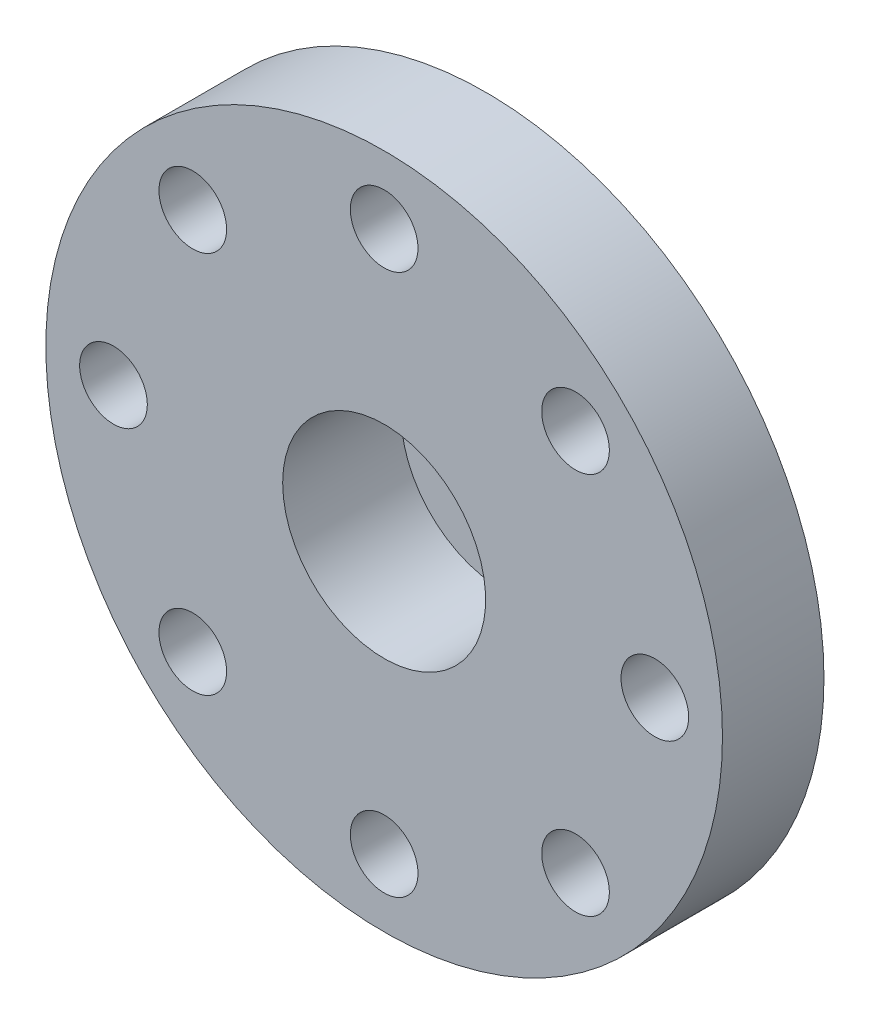
ISO-10303-21;
HEADER;
FILE_DESCRIPTION(('STEP AP214'),'2;1');
FILE_NAME('part.step','',(''),(''),'','','');
FILE_SCHEMA(('AUTOMOTIVE_DESIGN { 1 0 10303 214 1 1 1 1 }'));
ENDSEC;
DATA;
#1=APPLICATION_CONTEXT('core data for automotive mechanical design processes');
#2=APPLICATION_PROTOCOL_DEFINITION('international standard','automotive_design',2000,#1);
#3=PRODUCT_CONTEXT('',#1,'mechanical');
#4=PRODUCT('Part','Part','',(#3));
#5=PRODUCT_RELATED_PRODUCT_CATEGORY('part','',(#4));
#6=PRODUCT_DEFINITION_FORMATION('','',#4);
#7=PRODUCT_DEFINITION_CONTEXT('part definition',#1,'design');
#8=PRODUCT_DEFINITION('design','',#6,#7);
#9=PRODUCT_DEFINITION_SHAPE('','',#8);
#10=(LENGTH_UNIT() NAMED_UNIT(*) SI_UNIT(.MILLI.,.METRE.));
#11=(NAMED_UNIT(*) PLANE_ANGLE_UNIT() SI_UNIT($,.RADIAN.));
#12=(NAMED_UNIT(*) SI_UNIT($,.STERADIAN.) SOLID_ANGLE_UNIT());
#13=UNCERTAINTY_MEASURE_WITH_UNIT(LENGTH_MEASURE(1.E-05),#10,'distance_accuracy_value','');
#14=(GEOMETRIC_REPRESENTATION_CONTEXT(3) GLOBAL_UNCERTAINTY_ASSIGNED_CONTEXT((#13)) GLOBAL_UNIT_ASSIGNED_CONTEXT((#10,
#11,#12)) REPRESENTATION_CONTEXT('',''));
#15=CARTESIAN_POINT('',(0.,0.,0.));
#16=DIRECTION('',(0.,0.,1.));
#17=DIRECTION('',(1.,0.,0.));
#18=AXIS2_PLACEMENT_3D('',#15,#16,#17);
#19=CARTESIAN_POINT('',(0.,0.,3.));
#20=DIRECTION('',(0.,0.,1.));
#21=DIRECTION('',(1.,0.,0.));
#22=AXIS2_PLACEMENT_3D('',#19,#20,#21);
#23=PLANE('',#22);
#24=CARTESIAN_POINT('',(0.,0.,3.));
#25=DIRECTION('',(0.,0.,-1.));
#26=DIRECTION('',(-1.,0.,0.));
#27=AXIS2_PLACEMENT_3D('',#24,#25,#26);
#28=CIRCLE('',#27,3.);
#29=CARTESIAN_POINT('',(-3.,0.,3.));
#30=VERTEX_POINT('',#29);
#31=EDGE_CURVE('E103',#30,#30,#28,.T.);
#32=ORIENTED_EDGE('',*,*,#31,.T.);
#33=EDGE_LOOP('',(#32));
#34=FACE_BOUND('',#33,.T.);
#35=CARTESIAN_POINT('',(-7.99999999999966,-3.39548594421663E-13,3.));
#36=DIRECTION('',(0.,0.,1.));
#37=DIRECTION('',(1.,0.,0.));
#38=AXIS2_PLACEMENT_3D('',#35,#36,#37);
#39=CIRCLE('',#38,1.0000000000005);
#40=CARTESIAN_POINT('',(-6.99999999999916,-3.39548594421663E-13,3.));
#41=VERTEX_POINT('',#40);
#42=EDGE_CURVE('E85',#41,#41,#39,.T.);
#43=ORIENTED_EDGE('',*,*,#42,.F.);
#44=EDGE_LOOP('',(#43));
#45=FACE_BOUND('',#44,.T.);
#46=CARTESIAN_POINT('',(6.77137753964691E-13,-8.,3.));
#47=DIRECTION('',(0.,0.,1.));
#48=DIRECTION('',(1.,0.,0.));
#49=AXIS2_PLACEMENT_3D('',#46,#47,#48);
#50=CIRCLE('',#49,1.0000000000007);
#51=CARTESIAN_POINT('',(1.00000000000138,-8.,3.));
#52=VERTEX_POINT('',#51);
#53=EDGE_CURVE('E73',#52,#52,#50,.T.);
#54=ORIENTED_EDGE('',*,*,#53,.F.);
#55=EDGE_LOOP('',(#54));
#56=FACE_BOUND('',#55,.T.);
#57=CARTESIAN_POINT('',(8.00000000000034,3.38568876982346E-13,3.));
#58=DIRECTION('',(0.,0.,1.));
#59=DIRECTION('',(1.,0.,0.));
#60=AXIS2_PLACEMENT_3D('',#57,#58,#59);
#61=CIRCLE('',#60,1.00000000000025);
#62=CARTESIAN_POINT('',(9.00000000000059,3.38568876982346E-13,3.));
#63=VERTEX_POINT('',#62);
#64=EDGE_CURVE('E61',#63,#63,#61,.T.);
#65=ORIENTED_EDGE('',*,*,#64,.F.);
#66=EDGE_LOOP('',(#65));
#67=FACE_BOUND('',#66,.T.);
#68=CARTESIAN_POINT('',(0.,8.,3.));
#69=DIRECTION('',(0.,0.,1.));
#70=DIRECTION('',(1.,0.,0.));
#71=AXIS2_PLACEMENT_3D('',#68,#69,#70);
#72=CIRCLE('',#71,1.);
#73=CARTESIAN_POINT('',(0.999999999999999,8.,3.));
#74=VERTEX_POINT('',#73);
#75=EDGE_CURVE('E50',#74,#74,#72,.T.);
#76=ORIENTED_EDGE('',*,*,#75,.F.);
#77=EDGE_LOOP('',(#76));
#78=FACE_BOUND('',#77,.T.);
#79=CARTESIAN_POINT('',(0.,0.,3.));
#80=DIRECTION('',(0.,0.,1.));
#81=DIRECTION('',(1.,0.,0.));
#82=AXIS2_PLACEMENT_3D('',#79,#80,#81);
#83=CIRCLE('',#82,10.);
#84=CARTESIAN_POINT('',(10.,0.,3.));
#85=VERTEX_POINT('',#84);
#86=EDGE_CURVE('E42',#85,#85,#83,.T.);
#87=ORIENTED_EDGE('',*,*,#86,.T.);
#88=EDGE_LOOP('',(#87));
#89=FACE_BOUND('',#88,.T.);
#90=CARTESIAN_POINT('',(5.65685424949239,5.65685424949237,3.));
#91=DIRECTION('',(0.,0.,1.));
#92=DIRECTION('',(1.,0.,0.));
#93=AXIS2_PLACEMENT_3D('',#90,#91,#92);
#94=CIRCLE('',#93,1.);
#95=CARTESIAN_POINT('',(6.65685424949239,5.65685424949237,3.));
#96=VERTEX_POINT('',#95);
#97=EDGE_CURVE('E55',#96,#96,#94,.T.);
#98=ORIENTED_EDGE('',*,*,#97,.F.);
#99=EDGE_LOOP('',(#98));
#100=FACE_BOUND('',#99,.T.);
#101=CARTESIAN_POINT('',(5.65685424949296,-5.65685424949214,3.));
#102=DIRECTION('',(0.,0.,1.));
#103=DIRECTION('',(1.,0.,0.));
#104=AXIS2_PLACEMENT_3D('',#101,#102,#103);
#105=CIRCLE('',#104,1.00000000000052);
#106=CARTESIAN_POINT('',(6.65685424949348,-5.65685424949214,3.));
#107=VERTEX_POINT('',#106);
#108=EDGE_CURVE('E67',#107,#107,#105,.T.);
#109=ORIENTED_EDGE('',*,*,#108,.F.);
#110=EDGE_LOOP('',(#109));
#111=FACE_BOUND('',#110,.T.);
#112=CARTESIAN_POINT('',(-5.6568542494918,-5.65685424949262,3.));
#113=DIRECTION('',(0.,0.,1.));
#114=DIRECTION('',(1.,0.,0.));
#115=AXIS2_PLACEMENT_3D('',#112,#113,#114);
#116=CIRCLE('',#115,1.00000000000069);
#117=CARTESIAN_POINT('',(-4.65685424949111,-5.65685424949262,3.));
#118=VERTEX_POINT('',#117);
#119=EDGE_CURVE('E79',#118,#118,#116,.T.);
#120=ORIENTED_EDGE('',*,*,#119,.F.);
#121=EDGE_LOOP('',(#120));
#122=FACE_BOUND('',#121,.T.);
#123=CARTESIAN_POINT('',(-5.65685424949231,5.65685424949245,3.));
#124=DIRECTION('',(0.,0.,1.));
#125=DIRECTION('',(1.,0.,0.));
#126=AXIS2_PLACEMENT_3D('',#123,#124,#125);
#127=CIRCLE('',#126,1.);
#128=CARTESIAN_POINT('',(-4.65685424949231,5.65685424949245,3.));
#129=VERTEX_POINT('',#128);
#130=EDGE_CURVE('E91',#129,#129,#127,.T.);
#131=ORIENTED_EDGE('',*,*,#130,.F.);
#132=EDGE_LOOP('',(#131));
#133=FACE_BOUND('',#132,.T.);
#134=ADVANCED_FACE('F34',(#34,#45,#56,#67,#78,#89,#100,#111,#122,#133),#23,.T.);
#135=CARTESIAN_POINT('',(0.,0.,0.));
#136=DIRECTION('',(0.,0.,1.));
#137=DIRECTION('',(1.,0.,0.));
#138=AXIS2_PLACEMENT_3D('',#135,#136,#137);
#139=PLANE('',#138);
#140=CARTESIAN_POINT('',(0.,0.,0.));
#141=DIRECTION('',(0.,0.,1.));
#142=DIRECTION('',(1.,0.,0.));
#143=AXIS2_PLACEMENT_3D('',#140,#141,#142);
#144=CIRCLE('',#143,4.5);
#145=CARTESIAN_POINT('',(4.5,0.,0.));
#146=VERTEX_POINT('',#145);
#147=EDGE_CURVE('E10',#146,#146,#144,.F.);
#148=ORIENTED_EDGE('',*,*,#147,.F.);
#149=EDGE_LOOP('',(#148));
#150=FACE_BOUND('',#149,.T.);
#151=CARTESIAN_POINT('',(0.,0.,0.));
#152=DIRECTION('',(0.,0.,1.));
#153=DIRECTION('',(1.,0.,0.));
#154=AXIS2_PLACEMENT_3D('',#151,#152,#153);
#155=CIRCLE('',#154,10.);
#156=CARTESIAN_POINT('',(10.,0.,0.));
#157=VERTEX_POINT('',#156);
#158=EDGE_CURVE('E46',#157,#157,#155,.T.);
#159=ORIENTED_EDGE('',*,*,#158,.F.);
#160=EDGE_LOOP('',(#159));
#161=FACE_BOUND('',#160,.T.);
#162=CARTESIAN_POINT('',(0.,8.,0.));
#163=DIRECTION('',(0.,0.,1.));
#164=DIRECTION('',(1.,0.,0.));
#165=AXIS2_PLACEMENT_3D('',#162,#163,#164);
#166=CIRCLE('',#165,1.);
#167=CARTESIAN_POINT('',(0.999999999999999,8.,0.));
#168=VERTEX_POINT('',#167);
#169=EDGE_CURVE('E52',#168,#168,#166,.T.);
#170=ORIENTED_EDGE('',*,*,#169,.T.);
#171=EDGE_LOOP('',(#170));
#172=FACE_BOUND('',#171,.T.);
#173=CARTESIAN_POINT('',(5.65685424949239,5.65685424949237,0.));
#174=DIRECTION('',(0.,0.,1.));
#175=DIRECTION('',(1.,0.,0.));
#176=AXIS2_PLACEMENT_3D('',#173,#174,#175);
#177=CIRCLE('',#176,1.);
#178=CARTESIAN_POINT('',(6.65685424949239,5.65685424949237,0.));
#179=VERTEX_POINT('',#178);
#180=EDGE_CURVE('E58',#179,#179,#177,.T.);
#181=ORIENTED_EDGE('',*,*,#180,.T.);
#182=EDGE_LOOP('',(#181));
#183=FACE_BOUND('',#182,.T.);
#184=CARTESIAN_POINT('',(8.00000000000034,3.38568876982346E-13,0.));
#185=DIRECTION('',(0.,0.,1.));
#186=DIRECTION('',(1.,0.,0.));
#187=AXIS2_PLACEMENT_3D('',#184,#185,#186);
#188=CIRCLE('',#187,1.00000000000025);
#189=CARTESIAN_POINT('',(9.00000000000059,3.38568876982346E-13,0.));
#190=VERTEX_POINT('',#189);
#191=EDGE_CURVE('E64',#190,#190,#188,.T.);
#192=ORIENTED_EDGE('',*,*,#191,.T.);
#193=EDGE_LOOP('',(#192));
#194=FACE_BOUND('',#193,.T.);
#195=CARTESIAN_POINT('',(5.65685424949296,-5.65685424949214,0.));
#196=DIRECTION('',(0.,0.,1.));
#197=DIRECTION('',(1.,0.,0.));
#198=AXIS2_PLACEMENT_3D('',#195,#196,#197);
#199=CIRCLE('',#198,1.00000000000052);
#200=CARTESIAN_POINT('',(6.65685424949348,-5.65685424949214,0.));
#201=VERTEX_POINT('',#200);
#202=EDGE_CURVE('E70',#201,#201,#199,.T.);
#203=ORIENTED_EDGE('',*,*,#202,.T.);
#204=EDGE_LOOP('',(#203));
#205=FACE_BOUND('',#204,.T.);
#206=CARTESIAN_POINT('',(6.77137753964691E-13,-8.,0.));
#207=DIRECTION('',(0.,0.,1.));
#208=DIRECTION('',(1.,0.,0.));
#209=AXIS2_PLACEMENT_3D('',#206,#207,#208);
#210=CIRCLE('',#209,1.0000000000007);
#211=CARTESIAN_POINT('',(1.00000000000138,-8.,0.));
#212=VERTEX_POINT('',#211);
#213=EDGE_CURVE('E76',#212,#212,#210,.T.);
#214=ORIENTED_EDGE('',*,*,#213,.T.);
#215=EDGE_LOOP('',(#214));
#216=FACE_BOUND('',#215,.T.);
#217=CARTESIAN_POINT('',(-5.6568542494918,-5.65685424949262,0.));
#218=DIRECTION('',(0.,0.,1.));
#219=DIRECTION('',(1.,0.,0.));
#220=AXIS2_PLACEMENT_3D('',#217,#218,#219);
#221=CIRCLE('',#220,1.00000000000069);
#222=CARTESIAN_POINT('',(-4.65685424949111,-5.65685424949262,0.));
#223=VERTEX_POINT('',#222);
#224=EDGE_CURVE('E82',#223,#223,#221,.T.);
#225=ORIENTED_EDGE('',*,*,#224,.T.);
#226=EDGE_LOOP('',(#225));
#227=FACE_BOUND('',#226,.T.);
#228=CARTESIAN_POINT('',(-7.99999999999966,-3.39548594421663E-13,0.));
#229=DIRECTION('',(0.,0.,1.));
#230=DIRECTION('',(1.,0.,0.));
#231=AXIS2_PLACEMENT_3D('',#228,#229,#230);
#232=CIRCLE('',#231,1.0000000000005);
#233=CARTESIAN_POINT('',(-6.99999999999916,-3.39548594421663E-13,0.));
#234=VERTEX_POINT('',#233);
#235=EDGE_CURVE('E88',#234,#234,#232,.T.);
#236=ORIENTED_EDGE('',*,*,#235,.T.);
#237=EDGE_LOOP('',(#236));
#238=FACE_BOUND('',#237,.T.);
#239=CARTESIAN_POINT('',(-5.65685424949231,5.65685424949245,0.));
#240=DIRECTION('',(0.,0.,1.));
#241=DIRECTION('',(1.,0.,0.));
#242=AXIS2_PLACEMENT_3D('',#239,#240,#241);
#243=CIRCLE('',#242,1.);
#244=CARTESIAN_POINT('',(-4.65685424949231,5.65685424949245,0.));
#245=VERTEX_POINT('',#244);
#246=EDGE_CURVE('E94',#245,#245,#243,.T.);
#247=ORIENTED_EDGE('',*,*,#246,.T.);
#248=EDGE_LOOP('',(#247));
#249=FACE_BOUND('',#248,.T.);
#250=ADVANCED_FACE('F127',(#150,#161,#172,#183,#194,#205,#216,#227,#238,#249),#139,.F.);
#251=CARTESIAN_POINT('',(0.,0.,3.));
#252=DIRECTION('',(0.,0.,-1.));
#253=DIRECTION('',(-1.,0.,0.));
#254=AXIS2_PLACEMENT_3D('',#251,#252,#253);
#255=CYLINDRICAL_SURFACE('',#254,10.);
#256=ORIENTED_EDGE('',*,*,#86,.F.);
#257=EDGE_LOOP('',(#256));
#258=FACE_BOUND('',#257,.T.);
#259=ORIENTED_EDGE('',*,*,#158,.T.);
#260=EDGE_LOOP('',(#259));
#261=FACE_BOUND('',#260,.T.);
#262=ADVANCED_FACE('F36',(#258,#261),#255,.T.);
#263=CARTESIAN_POINT('',(0.,8.,3.));
#264=DIRECTION('',(0.,0.,-1.));
#265=DIRECTION('',(-1.,0.,0.));
#266=AXIS2_PLACEMENT_3D('',#263,#264,#265);
#267=CYLINDRICAL_SURFACE('',#266,1.);
#268=ORIENTED_EDGE('',*,*,#75,.T.);
#269=EDGE_LOOP('',(#268));
#270=FACE_BOUND('',#269,.T.);
#271=ORIENTED_EDGE('',*,*,#169,.F.);
#272=EDGE_LOOP('',(#271));
#273=FACE_BOUND('',#272,.T.);
#274=ADVANCED_FACE('F136',(#270,#273),#267,.F.);
#275=CARTESIAN_POINT('',(5.65685424949239,5.65685424949237,3.));
#276=DIRECTION('',(0.,0.,-1.));
#277=DIRECTION('',(-1.,0.,0.));
#278=AXIS2_PLACEMENT_3D('',#275,#276,#277);
#279=CYLINDRICAL_SURFACE('',#278,1.);
#280=ORIENTED_EDGE('',*,*,#97,.T.);
#281=EDGE_LOOP('',(#280));
#282=FACE_BOUND('',#281,.T.);
#283=ORIENTED_EDGE('',*,*,#180,.F.);
#284=EDGE_LOOP('',(#283));
#285=FACE_BOUND('',#284,.T.);
#286=ADVANCED_FACE('F139',(#282,#285),#279,.F.);
#287=CARTESIAN_POINT('',(8.00000000000034,3.38568876982346E-13,3.));
#288=DIRECTION('',(0.,0.,-1.));
#289=DIRECTION('',(-1.,0.,0.));
#290=AXIS2_PLACEMENT_3D('',#287,#288,#289);
#291=CYLINDRICAL_SURFACE('',#290,1.00000000000025);
#292=ORIENTED_EDGE('',*,*,#64,.T.);
#293=EDGE_LOOP('',(#292));
#294=FACE_BOUND('',#293,.T.);
#295=ORIENTED_EDGE('',*,*,#191,.F.);
#296=EDGE_LOOP('',(#295));
#297=FACE_BOUND('',#296,.T.);
#298=ADVANCED_FACE('F143',(#294,#297),#291,.F.);
#299=CARTESIAN_POINT('',(5.65685424949296,-5.65685424949214,3.));
#300=DIRECTION('',(0.,0.,-1.));
#301=DIRECTION('',(-1.,0.,0.));
#302=AXIS2_PLACEMENT_3D('',#299,#300,#301);
#303=CYLINDRICAL_SURFACE('',#302,1.00000000000052);
#304=ORIENTED_EDGE('',*,*,#108,.T.);
#305=EDGE_LOOP('',(#304));
#306=FACE_BOUND('',#305,.T.);
#307=ORIENTED_EDGE('',*,*,#202,.F.);
#308=EDGE_LOOP('',(#307));
#309=FACE_BOUND('',#308,.T.);
#310=ADVANCED_FACE('F147',(#306,#309),#303,.F.);
#311=CARTESIAN_POINT('',(6.77137753964691E-13,-8.,3.));
#312=DIRECTION('',(0.,0.,-1.));
#313=DIRECTION('',(-1.,0.,0.));
#314=AXIS2_PLACEMENT_3D('',#311,#312,#313);
#315=CYLINDRICAL_SURFACE('',#314,1.0000000000007);
#316=ORIENTED_EDGE('',*,*,#53,.T.);
#317=EDGE_LOOP('',(#316));
#318=FACE_BOUND('',#317,.T.);
#319=ORIENTED_EDGE('',*,*,#213,.F.);
#320=EDGE_LOOP('',(#319));
#321=FACE_BOUND('',#320,.T.);
#322=ADVANCED_FACE('F151',(#318,#321),#315,.F.);
#323=CARTESIAN_POINT('',(-5.6568542494918,-5.65685424949262,3.));
#324=DIRECTION('',(0.,0.,-1.));
#325=DIRECTION('',(-1.,0.,0.));
#326=AXIS2_PLACEMENT_3D('',#323,#324,#325);
#327=CYLINDRICAL_SURFACE('',#326,1.00000000000069);
#328=ORIENTED_EDGE('',*,*,#119,.T.);
#329=EDGE_LOOP('',(#328));
#330=FACE_BOUND('',#329,.T.);
#331=ORIENTED_EDGE('',*,*,#224,.F.);
#332=EDGE_LOOP('',(#331));
#333=FACE_BOUND('',#332,.T.);
#334=ADVANCED_FACE('F155',(#330,#333),#327,.F.);
#335=CARTESIAN_POINT('',(-7.99999999999966,-3.39548594421663E-13,3.));
#336=DIRECTION('',(0.,0.,-1.));
#337=DIRECTION('',(-1.,0.,0.));
#338=AXIS2_PLACEMENT_3D('',#335,#336,#337);
#339=CYLINDRICAL_SURFACE('',#338,1.0000000000005);
#340=ORIENTED_EDGE('',*,*,#42,.T.);
#341=EDGE_LOOP('',(#340));
#342=FACE_BOUND('',#341,.T.);
#343=ORIENTED_EDGE('',*,*,#235,.F.);
#344=EDGE_LOOP('',(#343));
#345=FACE_BOUND('',#344,.T.);
#346=ADVANCED_FACE('F159',(#342,#345),#339,.F.);
#347=CARTESIAN_POINT('',(-5.65685424949231,5.65685424949245,3.));
#348=DIRECTION('',(0.,0.,-1.));
#349=DIRECTION('',(-1.,0.,0.));
#350=AXIS2_PLACEMENT_3D('',#347,#348,#349);
#351=CYLINDRICAL_SURFACE('',#350,1.);
#352=ORIENTED_EDGE('',*,*,#130,.T.);
#353=EDGE_LOOP('',(#352));
#354=FACE_BOUND('',#353,.T.);
#355=ORIENTED_EDGE('',*,*,#246,.F.);
#356=EDGE_LOOP('',(#355));
#357=FACE_BOUND('',#356,.T.);
#358=ADVANCED_FACE('F163',(#354,#357),#351,.F.);
#359=CARTESIAN_POINT('',(0.,0.,-2.));
#360=DIRECTION('',(0.,0.,1.));
#361=DIRECTION('',(1.,0.,0.));
#362=AXIS2_PLACEMENT_3D('',#359,#360,#361);
#363=CYLINDRICAL_SURFACE('',#362,4.5);
#364=CARTESIAN_POINT('',(0.,0.,-2.));
#365=DIRECTION('',(0.,0.,-1.));
#366=DIRECTION('',(-1.,0.,0.));
#367=AXIS2_PLACEMENT_3D('',#364,#365,#366);
#368=CIRCLE('',#367,4.5);
#369=CARTESIAN_POINT('',(-4.5,0.,-2.));
#370=VERTEX_POINT('',#369);
#371=EDGE_CURVE('E97',#370,#370,#368,.T.);
#372=ORIENTED_EDGE('',*,*,#371,.F.);
#373=EDGE_LOOP('',(#372));
#374=FACE_BOUND('',#373,.T.);
#375=ORIENTED_EDGE('',*,*,#147,.T.);
#376=EDGE_LOOP('',(#375));
#377=FACE_BOUND('',#376,.T.);
#378=ADVANCED_FACE('F167',(#374,#377),#363,.T.);
#379=CARTESIAN_POINT('',(0.,0.,-2.));
#380=DIRECTION('',(0.,0.,-1.));
#381=DIRECTION('',(-1.,0.,0.));
#382=AXIS2_PLACEMENT_3D('',#379,#380,#381);
#383=PLANE('',#382);
#384=CARTESIAN_POINT('',(0.,0.,-2.));
#385=DIRECTION('',(0.,0.,-1.));
#386=DIRECTION('',(-1.,0.,0.));
#387=AXIS2_PLACEMENT_3D('',#384,#385,#386);
#388=CIRCLE('',#387,1.5);
#389=CARTESIAN_POINT('',(-1.5,0.,-2.));
#390=VERTEX_POINT('',#389);
#391=EDGE_CURVE('E108',#390,#390,#388,.T.);
#392=ORIENTED_EDGE('',*,*,#391,.F.);
#393=EDGE_LOOP('',(#392));
#394=FACE_BOUND('',#393,.T.);
#395=ORIENTED_EDGE('',*,*,#371,.T.);
#396=EDGE_LOOP('',(#395));
#397=FACE_BOUND('',#396,.T.);
#398=ADVANCED_FACE('F171',(#394,#397),#383,.T.);
#399=CARTESIAN_POINT('',(0.,0.,-0.5));
#400=DIRECTION('',(0.,0.,1.));
#401=DIRECTION('',(1.,0.,0.));
#402=AXIS2_PLACEMENT_3D('',#399,#400,#401);
#403=CYLINDRICAL_SURFACE('',#402,3.);
#404=CARTESIAN_POINT('',(0.,0.,-0.5));
#405=DIRECTION('',(0.,0.,-1.));
#406=DIRECTION('',(-1.,0.,0.));
#407=AXIS2_PLACEMENT_3D('',#404,#405,#406);
#408=CIRCLE('',#407,3.);
#409=CARTESIAN_POINT('',(-3.,0.,-0.5));
#410=VERTEX_POINT('',#409);
#411=EDGE_CURVE('E102',#410,#410,#408,.T.);
#412=ORIENTED_EDGE('',*,*,#411,.T.);
#413=EDGE_LOOP('',(#412));
#414=FACE_BOUND('',#413,.T.);
#415=ORIENTED_EDGE('',*,*,#31,.F.);
#416=EDGE_LOOP('',(#415));
#417=FACE_BOUND('',#416,.T.);
#418=ADVANCED_FACE('F124',(#414,#417),#403,.F.);
#419=CARTESIAN_POINT('',(0.,0.,-0.5));
#420=DIRECTION('',(0.,0.,-1.));
#421=DIRECTION('',(-1.,0.,0.));
#422=AXIS2_PLACEMENT_3D('',#419,#420,#421);
#423=PLANE('',#422);
#424=CARTESIAN_POINT('',(0.,0.,-0.5));
#425=DIRECTION('',(0.,0.,-1.));
#426=DIRECTION('',(-1.,0.,0.));
#427=AXIS2_PLACEMENT_3D('',#424,#425,#426);
#428=CIRCLE('',#427,1.5);
#429=CARTESIAN_POINT('',(-1.5,0.,-0.5));
#430=VERTEX_POINT('',#429);
#431=EDGE_CURVE('E38',#430,#430,#428,.T.);
#432=ORIENTED_EDGE('',*,*,#431,.T.);
#433=EDGE_LOOP('',(#432));
#434=FACE_BOUND('',#433,.T.);
#435=ORIENTED_EDGE('',*,*,#411,.F.);
#436=EDGE_LOOP('',(#435));
#437=FACE_BOUND('',#436,.T.);
#438=ADVANCED_FACE('F115',(#434,#437),#423,.F.);
#439=CARTESIAN_POINT('',(0.,0.,8.));
#440=DIRECTION('',(0.,0.,-1.));
#441=DIRECTION('',(-1.,0.,0.));
#442=AXIS2_PLACEMENT_3D('',#439,#440,#441);
#443=CYLINDRICAL_SURFACE('',#442,1.5);
#444=ORIENTED_EDGE('',*,*,#391,.T.);
#445=EDGE_LOOP('',(#444));
#446=FACE_BOUND('',#445,.T.);
#447=ORIENTED_EDGE('',*,*,#431,.F.);
#448=EDGE_LOOP('',(#447));
#449=FACE_BOUND('',#448,.T.);
#450=ADVANCED_FACE('F118',(#446,#449),#443,.F.);
#451=CLOSED_SHELL('',(#134,#250,#262,#274,#286,#298,#310,#322,#334,#346,#358,#378,#398,#418,
#438,#450));
#452=MANIFOLD_SOLID_BREP('B2',#451);
#453=ADVANCED_BREP_SHAPE_REPRESENTATION('',(#18,#452),#14);
#454=SHAPE_DEFINITION_REPRESENTATION(#9,#453);
ENDSEC;
END-ISO-10303-21;
